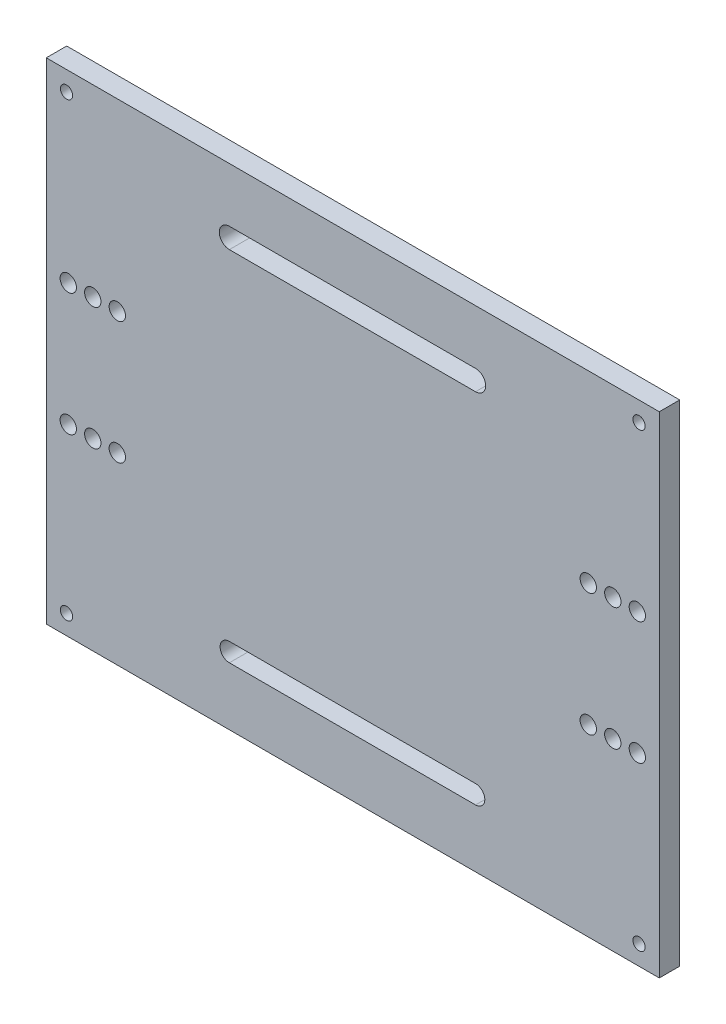
ISO-10303-21;
HEADER;
FILE_DESCRIPTION(('STEP AP214'),'2;1');
FILE_NAME('part.step','',(''),(''),'','','');
FILE_SCHEMA(('AUTOMOTIVE_DESIGN { 1 0 10303 214 1 1 1 1 }'));
ENDSEC;
DATA;
#1=APPLICATION_CONTEXT('core data for automotive mechanical design processes');
#2=APPLICATION_PROTOCOL_DEFINITION('international standard','automotive_design',2000,#1);
#3=PRODUCT_CONTEXT('',#1,'mechanical');
#4=PRODUCT('Part','Part','',(#3));
#5=PRODUCT_RELATED_PRODUCT_CATEGORY('part','',(#4));
#6=PRODUCT_DEFINITION_FORMATION('','',#4);
#7=PRODUCT_DEFINITION_CONTEXT('part definition',#1,'design');
#8=PRODUCT_DEFINITION('design','',#6,#7);
#9=PRODUCT_DEFINITION_SHAPE('','',#8);
#10=(LENGTH_UNIT() NAMED_UNIT(*) SI_UNIT(.MILLI.,.METRE.));
#11=(NAMED_UNIT(*) PLANE_ANGLE_UNIT() SI_UNIT($,.RADIAN.));
#12=(NAMED_UNIT(*) SI_UNIT($,.STERADIAN.) SOLID_ANGLE_UNIT());
#13=UNCERTAINTY_MEASURE_WITH_UNIT(LENGTH_MEASURE(1.E-05),#10,'distance_accuracy_value','');
#14=(GEOMETRIC_REPRESENTATION_CONTEXT(3) GLOBAL_UNCERTAINTY_ASSIGNED_CONTEXT((#13)) GLOBAL_UNIT_ASSIGNED_CONTEXT((#10,
#11,#12)) REPRESENTATION_CONTEXT('',''));
#15=CARTESIAN_POINT('',(0.,0.,0.));
#16=DIRECTION('',(0.,0.,1.));
#17=DIRECTION('',(1.,0.,0.));
#18=AXIS2_PLACEMENT_3D('',#15,#16,#17);
#19=CARTESIAN_POINT('',(0.,138.680861872725,5.));
#20=DIRECTION('',(0.,-1.,0.));
#21=DIRECTION('',(0.,0.,-1.));
#22=AXIS2_PLACEMENT_3D('',#19,#20,#21);
#23=PLANE('',#22);
#24=DIRECTION('',(-1.,0.,0.));
#25=VECTOR('',#24,1.);
#26=CARTESIAN_POINT('',(0.,138.680861872725,0.));
#27=LINE('',#26,#25);
#28=CARTESIAN_POINT('',(165.051044638639,138.680861872725,0.));
#29=VERTEX_POINT('',#28);
#30=CARTESIAN_POINT('',(15.0510446386395,138.680861872725,0.));
#31=VERTEX_POINT('',#30);
#32=EDGE_CURVE('E301',#29,#31,#27,.T.);
#33=ORIENTED_EDGE('',*,*,#32,.T.);
#34=DIRECTION('',(0.,0.,-1.));
#35=VECTOR('',#34,1.);
#36=CARTESIAN_POINT('',(15.0510446386395,138.680861872725,5.));
#37=LINE('',#36,#35);
#38=CARTESIAN_POINT('',(15.0510446386395,138.680861872725,5.));
#39=VERTEX_POINT('',#38);
#40=EDGE_CURVE('E11',#39,#31,#37,.T.);
#41=ORIENTED_EDGE('',*,*,#40,.F.);
#42=DIRECTION('',(-1.,0.,0.));
#43=VECTOR('',#42,1.);
#44=CARTESIAN_POINT('',(0.,138.680861872725,5.));
#45=LINE('',#44,#43);
#46=CARTESIAN_POINT('',(165.051044638639,138.680861872725,5.));
#47=VERTEX_POINT('',#46);
#48=EDGE_CURVE('E244',#47,#39,#45,.T.);
#49=ORIENTED_EDGE('',*,*,#48,.F.);
#50=DIRECTION('',(0.,0.,-1.));
#51=VECTOR('',#50,1.);
#52=CARTESIAN_POINT('',(165.051044638639,138.680861872725,5.));
#53=LINE('',#52,#51);
#54=EDGE_CURVE('E253',#47,#29,#53,.T.);
#55=ORIENTED_EDGE('',*,*,#54,.T.);
#56=EDGE_LOOP('',(#33,#41,#49,#55));
#57=FACE_BOUND('',#56,.T.);
#58=ADVANCED_FACE('F37',(#57),#23,.F.);
#59=CARTESIAN_POINT('',(15.0510446386395,0.,5.));
#60=DIRECTION('',(1.,0.,0.));
#61=DIRECTION('',(0.,0.,-1.));
#62=AXIS2_PLACEMENT_3D('',#59,#60,#61);
#63=PLANE('',#62);
#64=DIRECTION('',(0.,-1.,0.));
#65=VECTOR('',#64,1.);
#66=CARTESIAN_POINT('',(15.0510446386395,0.,0.));
#67=LINE('',#66,#65);
#68=CARTESIAN_POINT('',(15.0510446386395,18.6808618727253,0.));
#69=VERTEX_POINT('',#68);
#70=EDGE_CURVE('E304',#31,#69,#67,.T.);
#71=ORIENTED_EDGE('',*,*,#70,.T.);
#72=DIRECTION('',(0.,0.,-1.));
#73=VECTOR('',#72,1.);
#74=CARTESIAN_POINT('',(15.0510446386395,18.6808618727253,5.));
#75=LINE('',#74,#73);
#76=CARTESIAN_POINT('',(15.0510446386395,18.6808618727253,5.));
#77=VERTEX_POINT('',#76);
#78=EDGE_CURVE('E45',#77,#69,#75,.T.);
#79=ORIENTED_EDGE('',*,*,#78,.F.);
#80=DIRECTION('',(0.,-1.,0.));
#81=VECTOR('',#80,1.);
#82=CARTESIAN_POINT('',(15.0510446386395,0.,5.));
#83=LINE('',#82,#81);
#84=EDGE_CURVE('E247',#39,#77,#83,.T.);
#85=ORIENTED_EDGE('',*,*,#84,.F.);
#86=ORIENTED_EDGE('',*,*,#40,.T.);
#87=EDGE_LOOP('',(#71,#79,#85,#86));
#88=FACE_BOUND('',#87,.T.);
#89=ADVANCED_FACE('F333',(#88),#63,.F.);
#90=CARTESIAN_POINT('',(0.,18.6808618727253,5.));
#91=DIRECTION('',(0.,1.,0.));
#92=DIRECTION('',(-1.,0.,0.));
#93=AXIS2_PLACEMENT_3D('',#90,#91,#92);
#94=PLANE('',#93);
#95=DIRECTION('',(1.,0.,0.));
#96=VECTOR('',#95,1.);
#97=CARTESIAN_POINT('',(0.,18.6808618727253,0.));
#98=LINE('',#97,#96);
#99=CARTESIAN_POINT('',(165.051044638639,18.6808618727253,0.));
#100=VERTEX_POINT('',#99);
#101=EDGE_CURVE('E306',#69,#100,#98,.T.);
#102=ORIENTED_EDGE('',*,*,#101,.T.);
#103=DIRECTION('',(0.,0.,-1.));
#104=VECTOR('',#103,1.);
#105=CARTESIAN_POINT('',(165.051044638639,18.6808618727253,5.));
#106=LINE('',#105,#104);
#107=CARTESIAN_POINT('',(165.051044638639,18.6808618727253,5.));
#108=VERTEX_POINT('',#107);
#109=EDGE_CURVE('E311',#108,#100,#106,.T.);
#110=ORIENTED_EDGE('',*,*,#109,.F.);
#111=DIRECTION('',(1.,0.,0.));
#112=VECTOR('',#111,1.);
#113=CARTESIAN_POINT('',(0.,18.6808618727253,5.));
#114=LINE('',#113,#112);
#115=EDGE_CURVE('E249',#77,#108,#114,.T.);
#116=ORIENTED_EDGE('',*,*,#115,.F.);
#117=ORIENTED_EDGE('',*,*,#78,.T.);
#118=EDGE_LOOP('',(#102,#110,#116,#117));
#119=FACE_BOUND('',#118,.T.);
#120=ADVANCED_FACE('F318',(#119),#94,.F.);
#121=CARTESIAN_POINT('',(20.4274241830881,93.6808618727253,5.));
#122=DIRECTION('',(0.,0.,-1.));
#123=DIRECTION('',(-1.,0.,0.));
#124=AXIS2_PLACEMENT_3D('',#121,#122,#123);
#125=CYLINDRICAL_SURFACE('',#124,2.);
#126=CARTESIAN_POINT('',(20.4274241830881,93.6808618727253,5.));
#127=DIRECTION('',(0.,0.,1.));
#128=DIRECTION('',(1.,0.,0.));
#129=AXIS2_PLACEMENT_3D('',#126,#127,#128);
#130=CIRCLE('',#129,2.);
#131=CARTESIAN_POINT('',(22.4274241830881,93.6808618727253,5.));
#132=VERTEX_POINT('',#131);
#133=EDGE_CURVE('E241',#132,#132,#130,.T.);
#134=ORIENTED_EDGE('',*,*,#133,.T.);
#135=EDGE_LOOP('',(#134));
#136=FACE_BOUND('',#135,.T.);
#137=CARTESIAN_POINT('',(20.4274241830881,93.6808618727253,0.));
#138=DIRECTION('',(0.,0.,1.));
#139=DIRECTION('',(1.,0.,0.));
#140=AXIS2_PLACEMENT_3D('',#137,#138,#139);
#141=CIRCLE('',#140,2.);
#142=CARTESIAN_POINT('',(22.4274241830881,93.6808618727253,0.));
#143=VERTEX_POINT('',#142);
#144=EDGE_CURVE('E298',#143,#143,#141,.T.);
#145=ORIENTED_EDGE('',*,*,#144,.F.);
#146=EDGE_LOOP('',(#145));
#147=FACE_BOUND('',#146,.T.);
#148=ADVANCED_FACE('F340',(#136,#147),#125,.F.);
#149=CARTESIAN_POINT('',(26.4274241830881,93.6808618727253,5.));
#150=DIRECTION('',(0.,0.,-1.));
#151=DIRECTION('',(-1.,0.,0.));
#152=AXIS2_PLACEMENT_3D('',#149,#150,#151);
#153=CYLINDRICAL_SURFACE('',#152,2.);
#154=CARTESIAN_POINT('',(26.4274241830881,93.6808618727253,5.));
#155=DIRECTION('',(0.,0.,1.));
#156=DIRECTION('',(1.,0.,0.));
#157=AXIS2_PLACEMENT_3D('',#154,#155,#156);
#158=CIRCLE('',#157,2.);
#159=CARTESIAN_POINT('',(28.4274241830881,93.6808618727253,5.));
#160=VERTEX_POINT('',#159);
#161=EDGE_CURVE('E238',#160,#160,#158,.T.);
#162=ORIENTED_EDGE('',*,*,#161,.T.);
#163=EDGE_LOOP('',(#162));
#164=FACE_BOUND('',#163,.T.);
#165=CARTESIAN_POINT('',(26.4274241830881,93.6808618727253,0.));
#166=DIRECTION('',(0.,0.,1.));
#167=DIRECTION('',(1.,0.,0.));
#168=AXIS2_PLACEMENT_3D('',#165,#166,#167);
#169=CIRCLE('',#168,2.);
#170=CARTESIAN_POINT('',(28.4274241830881,93.6808618727253,0.));
#171=VERTEX_POINT('',#170);
#172=EDGE_CURVE('E295',#171,#171,#169,.T.);
#173=ORIENTED_EDGE('',*,*,#172,.F.);
#174=EDGE_LOOP('',(#173));
#175=FACE_BOUND('',#174,.T.);
#176=ADVANCED_FACE('F347',(#164,#175),#153,.F.);
#177=CARTESIAN_POINT('',(32.4274241830881,93.6808618727253,5.));
#178=DIRECTION('',(0.,0.,-1.));
#179=DIRECTION('',(-1.,0.,0.));
#180=AXIS2_PLACEMENT_3D('',#177,#178,#179);
#181=CYLINDRICAL_SURFACE('',#180,2.);
#182=CARTESIAN_POINT('',(32.4274241830881,93.6808618727253,5.));
#183=DIRECTION('',(0.,0.,1.));
#184=DIRECTION('',(1.,0.,0.));
#185=AXIS2_PLACEMENT_3D('',#182,#183,#184);
#186=CIRCLE('',#185,2.);
#187=CARTESIAN_POINT('',(34.4274241830881,93.6808618727253,5.));
#188=VERTEX_POINT('',#187);
#189=EDGE_CURVE('E235',#188,#188,#186,.T.);
#190=ORIENTED_EDGE('',*,*,#189,.T.);
#191=EDGE_LOOP('',(#190));
#192=FACE_BOUND('',#191,.T.);
#193=CARTESIAN_POINT('',(32.4274241830881,93.6808618727253,0.));
#194=DIRECTION('',(0.,0.,1.));
#195=DIRECTION('',(1.,0.,0.));
#196=AXIS2_PLACEMENT_3D('',#193,#194,#195);
#197=CIRCLE('',#196,2.);
#198=CARTESIAN_POINT('',(34.4274241830881,93.6808618727253,0.));
#199=VERTEX_POINT('',#198);
#200=EDGE_CURVE('E292',#199,#199,#197,.T.);
#201=ORIENTED_EDGE('',*,*,#200,.F.);
#202=EDGE_LOOP('',(#201));
#203=FACE_BOUND('',#202,.T.);
#204=ADVANCED_FACE('F351',(#192,#203),#181,.F.);
#205=CARTESIAN_POINT('',(20.4274241830881,63.6808618727253,5.));
#206=DIRECTION('',(0.,0.,-1.));
#207=DIRECTION('',(-1.,0.,0.));
#208=AXIS2_PLACEMENT_3D('',#205,#206,#207);
#209=CYLINDRICAL_SURFACE('',#208,2.);
#210=CARTESIAN_POINT('',(20.4274241830881,63.6808618727253,5.));
#211=DIRECTION('',(0.,0.,1.));
#212=DIRECTION('',(1.,0.,0.));
#213=AXIS2_PLACEMENT_3D('',#210,#211,#212);
#214=CIRCLE('',#213,2.);
#215=CARTESIAN_POINT('',(22.4274241830881,63.6808618727253,5.));
#216=VERTEX_POINT('',#215);
#217=EDGE_CURVE('E232',#216,#216,#214,.T.);
#218=ORIENTED_EDGE('',*,*,#217,.T.);
#219=EDGE_LOOP('',(#218));
#220=FACE_BOUND('',#219,.T.);
#221=CARTESIAN_POINT('',(20.4274241830881,63.6808618727253,0.));
#222=DIRECTION('',(0.,0.,1.));
#223=DIRECTION('',(1.,0.,0.));
#224=AXIS2_PLACEMENT_3D('',#221,#222,#223);
#225=CIRCLE('',#224,2.);
#226=CARTESIAN_POINT('',(22.4274241830881,63.6808618727253,0.));
#227=VERTEX_POINT('',#226);
#228=EDGE_CURVE('E289',#227,#227,#225,.T.);
#229=ORIENTED_EDGE('',*,*,#228,.F.);
#230=EDGE_LOOP('',(#229));
#231=FACE_BOUND('',#230,.T.);
#232=ADVANCED_FACE('F355',(#220,#231),#209,.F.);
#233=CARTESIAN_POINT('',(26.4274241830881,63.6808618727253,5.));
#234=DIRECTION('',(0.,0.,-1.));
#235=DIRECTION('',(-1.,0.,0.));
#236=AXIS2_PLACEMENT_3D('',#233,#234,#235);
#237=CYLINDRICAL_SURFACE('',#236,2.);
#238=CARTESIAN_POINT('',(26.4274241830881,63.6808618727253,5.));
#239=DIRECTION('',(0.,0.,1.));
#240=DIRECTION('',(1.,0.,0.));
#241=AXIS2_PLACEMENT_3D('',#238,#239,#240);
#242=CIRCLE('',#241,2.);
#243=CARTESIAN_POINT('',(28.4274241830881,63.6808618727253,5.));
#244=VERTEX_POINT('',#243);
#245=EDGE_CURVE('E229',#244,#244,#242,.T.);
#246=ORIENTED_EDGE('',*,*,#245,.T.);
#247=EDGE_LOOP('',(#246));
#248=FACE_BOUND('',#247,.T.);
#249=CARTESIAN_POINT('',(26.4274241830881,63.6808618727253,0.));
#250=DIRECTION('',(0.,0.,1.));
#251=DIRECTION('',(1.,0.,0.));
#252=AXIS2_PLACEMENT_3D('',#249,#250,#251);
#253=CIRCLE('',#252,2.);
#254=CARTESIAN_POINT('',(28.4274241830881,63.6808618727253,0.));
#255=VERTEX_POINT('',#254);
#256=EDGE_CURVE('E286',#255,#255,#253,.T.);
#257=ORIENTED_EDGE('',*,*,#256,.F.);
#258=EDGE_LOOP('',(#257));
#259=FACE_BOUND('',#258,.T.);
#260=ADVANCED_FACE('F359',(#248,#259),#237,.F.);
#261=CARTESIAN_POINT('',(32.4274241830881,63.6808618727253,5.));
#262=DIRECTION('',(0.,0.,-1.));
#263=DIRECTION('',(-1.,0.,0.));
#264=AXIS2_PLACEMENT_3D('',#261,#262,#263);
#265=CYLINDRICAL_SURFACE('',#264,2.);
#266=CARTESIAN_POINT('',(32.4274241830881,63.6808618727253,5.));
#267=DIRECTION('',(0.,0.,1.));
#268=DIRECTION('',(1.,0.,0.));
#269=AXIS2_PLACEMENT_3D('',#266,#267,#268);
#270=CIRCLE('',#269,2.);
#271=CARTESIAN_POINT('',(34.4274241830881,63.6808618727253,5.));
#272=VERTEX_POINT('',#271);
#273=EDGE_CURVE('E226',#272,#272,#270,.T.);
#274=ORIENTED_EDGE('',*,*,#273,.T.);
#275=EDGE_LOOP('',(#274));
#276=FACE_BOUND('',#275,.T.);
#277=CARTESIAN_POINT('',(32.4274241830881,63.6808618727253,0.));
#278=DIRECTION('',(0.,0.,1.));
#279=DIRECTION('',(1.,0.,0.));
#280=AXIS2_PLACEMENT_3D('',#277,#278,#279);
#281=CIRCLE('',#280,2.);
#282=CARTESIAN_POINT('',(34.4274241830881,63.6808618727253,0.));
#283=VERTEX_POINT('',#282);
#284=EDGE_CURVE('E283',#283,#283,#281,.T.);
#285=ORIENTED_EDGE('',*,*,#284,.F.);
#286=EDGE_LOOP('',(#285));
#287=FACE_BOUND('',#286,.T.);
#288=ADVANCED_FACE('F363',(#276,#287),#265,.F.);
#289=CARTESIAN_POINT('',(159.674665094191,93.6808618727253,5.));
#290=DIRECTION('',(0.,0.,-1.));
#291=DIRECTION('',(-1.,0.,0.));
#292=AXIS2_PLACEMENT_3D('',#289,#290,#291);
#293=CYLINDRICAL_SURFACE('',#292,2.);
#294=CARTESIAN_POINT('',(159.674665094191,93.6808618727253,5.));
#295=DIRECTION('',(0.,0.,1.));
#296=DIRECTION('',(1.,0.,0.));
#297=AXIS2_PLACEMENT_3D('',#294,#295,#296);
#298=CIRCLE('',#297,2.);
#299=CARTESIAN_POINT('',(161.674665094191,93.6808618727253,5.));
#300=VERTEX_POINT('',#299);
#301=EDGE_CURVE('E223',#300,#300,#298,.T.);
#302=ORIENTED_EDGE('',*,*,#301,.T.);
#303=EDGE_LOOP('',(#302));
#304=FACE_BOUND('',#303,.T.);
#305=CARTESIAN_POINT('',(159.674665094191,93.6808618727253,0.));
#306=DIRECTION('',(0.,0.,1.));
#307=DIRECTION('',(1.,0.,0.));
#308=AXIS2_PLACEMENT_3D('',#305,#306,#307);
#309=CIRCLE('',#308,2.);
#310=CARTESIAN_POINT('',(161.674665094191,93.6808618727253,0.));
#311=VERTEX_POINT('',#310);
#312=EDGE_CURVE('E280',#311,#311,#309,.T.);
#313=ORIENTED_EDGE('',*,*,#312,.F.);
#314=EDGE_LOOP('',(#313));
#315=FACE_BOUND('',#314,.T.);
#316=ADVANCED_FACE('F367',(#304,#315),#293,.F.);
#317=CARTESIAN_POINT('',(153.674665094191,93.6808618727253,5.));
#318=DIRECTION('',(0.,0.,-1.));
#319=DIRECTION('',(-1.,0.,0.));
#320=AXIS2_PLACEMENT_3D('',#317,#318,#319);
#321=CYLINDRICAL_SURFACE('',#320,2.);
#322=CARTESIAN_POINT('',(153.674665094191,93.6808618727253,5.));
#323=DIRECTION('',(0.,0.,1.));
#324=DIRECTION('',(1.,0.,0.));
#325=AXIS2_PLACEMENT_3D('',#322,#323,#324);
#326=CIRCLE('',#325,2.);
#327=CARTESIAN_POINT('',(155.674665094191,93.6808618727253,5.));
#328=VERTEX_POINT('',#327);
#329=EDGE_CURVE('E220',#328,#328,#326,.T.);
#330=ORIENTED_EDGE('',*,*,#329,.T.);
#331=EDGE_LOOP('',(#330));
#332=FACE_BOUND('',#331,.T.);
#333=CARTESIAN_POINT('',(153.674665094191,93.6808618727253,0.));
#334=DIRECTION('',(0.,0.,1.));
#335=DIRECTION('',(1.,0.,0.));
#336=AXIS2_PLACEMENT_3D('',#333,#334,#335);
#337=CIRCLE('',#336,2.);
#338=CARTESIAN_POINT('',(155.674665094191,93.6808618727253,0.));
#339=VERTEX_POINT('',#338);
#340=EDGE_CURVE('E277',#339,#339,#337,.T.);
#341=ORIENTED_EDGE('',*,*,#340,.F.);
#342=EDGE_LOOP('',(#341));
#343=FACE_BOUND('',#342,.T.);
#344=ADVANCED_FACE('F371',(#332,#343),#321,.F.);
#345=CARTESIAN_POINT('',(147.674665094191,93.6808618727253,5.));
#346=DIRECTION('',(0.,0.,-1.));
#347=DIRECTION('',(-1.,0.,0.));
#348=AXIS2_PLACEMENT_3D('',#345,#346,#347);
#349=CYLINDRICAL_SURFACE('',#348,2.);
#350=CARTESIAN_POINT('',(147.674665094191,93.6808618727253,5.));
#351=DIRECTION('',(0.,0.,1.));
#352=DIRECTION('',(1.,0.,0.));
#353=AXIS2_PLACEMENT_3D('',#350,#351,#352);
#354=CIRCLE('',#353,2.);
#355=CARTESIAN_POINT('',(149.674665094191,93.6808618727253,5.));
#356=VERTEX_POINT('',#355);
#357=EDGE_CURVE('E217',#356,#356,#354,.T.);
#358=ORIENTED_EDGE('',*,*,#357,.T.);
#359=EDGE_LOOP('',(#358));
#360=FACE_BOUND('',#359,.T.);
#361=CARTESIAN_POINT('',(147.674665094191,93.6808618727253,0.));
#362=DIRECTION('',(0.,0.,1.));
#363=DIRECTION('',(1.,0.,0.));
#364=AXIS2_PLACEMENT_3D('',#361,#362,#363);
#365=CIRCLE('',#364,2.);
#366=CARTESIAN_POINT('',(149.674665094191,93.6808618727253,0.));
#367=VERTEX_POINT('',#366);
#368=EDGE_CURVE('E274',#367,#367,#365,.T.);
#369=ORIENTED_EDGE('',*,*,#368,.F.);
#370=EDGE_LOOP('',(#369));
#371=FACE_BOUND('',#370,.T.);
#372=ADVANCED_FACE('F375',(#360,#371),#349,.F.);
#373=CARTESIAN_POINT('',(159.674665094191,63.6808618727253,5.));
#374=DIRECTION('',(0.,0.,-1.));
#375=DIRECTION('',(-1.,0.,0.));
#376=AXIS2_PLACEMENT_3D('',#373,#374,#375);
#377=CYLINDRICAL_SURFACE('',#376,2.);
#378=CARTESIAN_POINT('',(159.674665094191,63.6808618727253,5.));
#379=DIRECTION('',(0.,0.,1.));
#380=DIRECTION('',(1.,0.,0.));
#381=AXIS2_PLACEMENT_3D('',#378,#379,#380);
#382=CIRCLE('',#381,2.);
#383=CARTESIAN_POINT('',(161.674665094191,63.6808618727253,5.));
#384=VERTEX_POINT('',#383);
#385=EDGE_CURVE('E214',#384,#384,#382,.T.);
#386=ORIENTED_EDGE('',*,*,#385,.T.);
#387=EDGE_LOOP('',(#386));
#388=FACE_BOUND('',#387,.T.);
#389=CARTESIAN_POINT('',(159.674665094191,63.6808618727253,0.));
#390=DIRECTION('',(0.,0.,1.));
#391=DIRECTION('',(1.,0.,0.));
#392=AXIS2_PLACEMENT_3D('',#389,#390,#391);
#393=CIRCLE('',#392,2.);
#394=CARTESIAN_POINT('',(161.674665094191,63.6808618727253,0.));
#395=VERTEX_POINT('',#394);
#396=EDGE_CURVE('E271',#395,#395,#393,.T.);
#397=ORIENTED_EDGE('',*,*,#396,.F.);
#398=EDGE_LOOP('',(#397));
#399=FACE_BOUND('',#398,.T.);
#400=ADVANCED_FACE('F379',(#388,#399),#377,.F.);
#401=CARTESIAN_POINT('',(153.674665094191,63.6808618727253,5.));
#402=DIRECTION('',(0.,0.,-1.));
#403=DIRECTION('',(-1.,0.,0.));
#404=AXIS2_PLACEMENT_3D('',#401,#402,#403);
#405=CYLINDRICAL_SURFACE('',#404,2.);
#406=CARTESIAN_POINT('',(153.674665094191,63.6808618727253,5.));
#407=DIRECTION('',(0.,0.,1.));
#408=DIRECTION('',(1.,0.,0.));
#409=AXIS2_PLACEMENT_3D('',#406,#407,#408);
#410=CIRCLE('',#409,2.);
#411=CARTESIAN_POINT('',(155.674665094191,63.6808618727253,5.));
#412=VERTEX_POINT('',#411);
#413=EDGE_CURVE('E211',#412,#412,#410,.T.);
#414=ORIENTED_EDGE('',*,*,#413,.T.);
#415=EDGE_LOOP('',(#414));
#416=FACE_BOUND('',#415,.T.);
#417=CARTESIAN_POINT('',(153.674665094191,63.6808618727253,0.));
#418=DIRECTION('',(0.,0.,1.));
#419=DIRECTION('',(1.,0.,0.));
#420=AXIS2_PLACEMENT_3D('',#417,#418,#419);
#421=CIRCLE('',#420,2.);
#422=CARTESIAN_POINT('',(155.674665094191,63.6808618727253,0.));
#423=VERTEX_POINT('',#422);
#424=EDGE_CURVE('E268',#423,#423,#421,.T.);
#425=ORIENTED_EDGE('',*,*,#424,.F.);
#426=EDGE_LOOP('',(#425));
#427=FACE_BOUND('',#426,.T.);
#428=ADVANCED_FACE('F383',(#416,#427),#405,.F.);
#429=CARTESIAN_POINT('',(147.674665094191,63.6808618727253,5.));
#430=DIRECTION('',(0.,0.,-1.));
#431=DIRECTION('',(-1.,0.,0.));
#432=AXIS2_PLACEMENT_3D('',#429,#430,#431);
#433=CYLINDRICAL_SURFACE('',#432,2.);
#434=CARTESIAN_POINT('',(147.674665094191,63.6808618727253,5.));
#435=DIRECTION('',(0.,0.,1.));
#436=DIRECTION('',(1.,0.,0.));
#437=AXIS2_PLACEMENT_3D('',#434,#435,#436);
#438=CIRCLE('',#437,2.);
#439=CARTESIAN_POINT('',(149.674665094191,63.6808618727253,5.));
#440=VERTEX_POINT('',#439);
#441=EDGE_CURVE('E208',#440,#440,#438,.T.);
#442=ORIENTED_EDGE('',*,*,#441,.T.);
#443=EDGE_LOOP('',(#442));
#444=FACE_BOUND('',#443,.T.);
#445=CARTESIAN_POINT('',(147.674665094191,63.6808618727253,0.));
#446=DIRECTION('',(0.,0.,1.));
#447=DIRECTION('',(1.,0.,0.));
#448=AXIS2_PLACEMENT_3D('',#445,#446,#447);
#449=CIRCLE('',#448,2.);
#450=CARTESIAN_POINT('',(149.674665094191,63.6808618727253,0.));
#451=VERTEX_POINT('',#450);
#452=EDGE_CURVE('E265',#451,#451,#449,.T.);
#453=ORIENTED_EDGE('',*,*,#452,.F.);
#454=EDGE_LOOP('',(#453));
#455=FACE_BOUND('',#454,.T.);
#456=ADVANCED_FACE('F387',(#444,#455),#433,.F.);
#457=CARTESIAN_POINT('',(20.0056706292298,133.907298568765,5.));
#458=DIRECTION('',(0.,0.,-1.));
#459=DIRECTION('',(-1.,0.,0.));
#460=AXIS2_PLACEMENT_3D('',#457,#458,#459);
#461=CYLINDRICAL_SURFACE('',#460,1.5);
#462=CARTESIAN_POINT('',(20.0056706292298,133.907298568765,5.));
#463=DIRECTION('',(0.,0.,1.));
#464=DIRECTION('',(1.,0.,0.));
#465=AXIS2_PLACEMENT_3D('',#462,#463,#464);
#466=CIRCLE('',#465,1.5);
#467=CARTESIAN_POINT('',(21.5056706292298,133.907298568765,5.));
#468=VERTEX_POINT('',#467);
#469=EDGE_CURVE('E205',#468,#468,#466,.T.);
#470=ORIENTED_EDGE('',*,*,#469,.T.);
#471=EDGE_LOOP('',(#470));
#472=FACE_BOUND('',#471,.T.);
#473=CARTESIAN_POINT('',(20.0056706292298,133.907298568765,0.));
#474=DIRECTION('',(0.,0.,1.));
#475=DIRECTION('',(1.,0.,0.));
#476=AXIS2_PLACEMENT_3D('',#473,#474,#475);
#477=CIRCLE('',#476,1.5);
#478=CARTESIAN_POINT('',(21.5056706292298,133.907298568765,0.));
#479=VERTEX_POINT('',#478);
#480=EDGE_CURVE('E262',#479,#479,#477,.T.);
#481=ORIENTED_EDGE('',*,*,#480,.F.);
#482=EDGE_LOOP('',(#481));
#483=FACE_BOUND('',#482,.T.);
#484=ADVANCED_FACE('F391',(#472,#483),#461,.F.);
#485=CARTESIAN_POINT('',(160.096418648049,133.907298568765,5.));
#486=DIRECTION('',(0.,0.,-1.));
#487=DIRECTION('',(-1.,0.,0.));
#488=AXIS2_PLACEMENT_3D('',#485,#486,#487);
#489=CYLINDRICAL_SURFACE('',#488,1.5);
#490=CARTESIAN_POINT('',(160.096418648049,133.907298568765,5.));
#491=DIRECTION('',(0.,0.,1.));
#492=DIRECTION('',(1.,0.,0.));
#493=AXIS2_PLACEMENT_3D('',#490,#491,#492);
#494=CIRCLE('',#493,1.5);
#495=CARTESIAN_POINT('',(161.596418648049,133.907298568765,5.));
#496=VERTEX_POINT('',#495);
#497=EDGE_CURVE('E202',#496,#496,#494,.T.);
#498=ORIENTED_EDGE('',*,*,#497,.T.);
#499=EDGE_LOOP('',(#498));
#500=FACE_BOUND('',#499,.T.);
#501=CARTESIAN_POINT('',(160.096418648049,133.907298568765,0.));
#502=DIRECTION('',(0.,0.,1.));
#503=DIRECTION('',(1.,0.,0.));
#504=AXIS2_PLACEMENT_3D('',#501,#502,#503);
#505=CIRCLE('',#504,1.5);
#506=CARTESIAN_POINT('',(161.596418648049,133.907298568765,0.));
#507=VERTEX_POINT('',#506);
#508=EDGE_CURVE('E259',#507,#507,#505,.T.);
#509=ORIENTED_EDGE('',*,*,#508,.F.);
#510=EDGE_LOOP('',(#509));
#511=FACE_BOUND('',#510,.T.);
#512=ADVANCED_FACE('F395',(#500,#511),#489,.F.);
#513=CARTESIAN_POINT('',(20.0056706292298,23.4544251766853,5.));
#514=DIRECTION('',(0.,0.,-1.));
#515=DIRECTION('',(-1.,0.,0.));
#516=AXIS2_PLACEMENT_3D('',#513,#514,#515);
#517=CYLINDRICAL_SURFACE('',#516,1.5);
#518=CARTESIAN_POINT('',(20.0056706292298,23.4544251766853,5.));
#519=DIRECTION('',(0.,0.,1.));
#520=DIRECTION('',(1.,0.,0.));
#521=AXIS2_PLACEMENT_3D('',#518,#519,#520);
#522=CIRCLE('',#521,1.5);
#523=CARTESIAN_POINT('',(21.5056706292298,23.4544251766853,5.));
#524=VERTEX_POINT('',#523);
#525=EDGE_CURVE('E198',#524,#524,#522,.T.);
#526=ORIENTED_EDGE('',*,*,#525,.T.);
#527=EDGE_LOOP('',(#526));
#528=FACE_BOUND('',#527,.T.);
#529=CARTESIAN_POINT('',(20.0056706292298,23.4544251766853,0.));
#530=DIRECTION('',(0.,0.,1.));
#531=DIRECTION('',(1.,0.,0.));
#532=AXIS2_PLACEMENT_3D('',#529,#530,#531);
#533=CIRCLE('',#532,1.5);
#534=CARTESIAN_POINT('',(21.5056706292298,23.4544251766853,0.));
#535=VERTEX_POINT('',#534);
#536=EDGE_CURVE('E256',#535,#535,#533,.T.);
#537=ORIENTED_EDGE('',*,*,#536,.F.);
#538=EDGE_LOOP('',(#537));
#539=FACE_BOUND('',#538,.T.);
#540=ADVANCED_FACE('F398',(#528,#539),#517,.F.);
#541=CARTESIAN_POINT('',(160.096418648049,23.4544251766853,5.));
#542=DIRECTION('',(0.,0.,-1.));
#543=DIRECTION('',(-1.,0.,0.));
#544=AXIS2_PLACEMENT_3D('',#541,#542,#543);
#545=CYLINDRICAL_SURFACE('',#544,1.5);
#546=CARTESIAN_POINT('',(160.096418648049,23.4544251766853,5.));
#547=DIRECTION('',(0.,0.,1.));
#548=DIRECTION('',(1.,0.,0.));
#549=AXIS2_PLACEMENT_3D('',#546,#547,#548);
#550=CIRCLE('',#549,1.5);
#551=CARTESIAN_POINT('',(161.596418648049,23.4544251766853,5.));
#552=VERTEX_POINT('',#551);
#553=EDGE_CURVE('E195',#552,#552,#550,.T.);
#554=ORIENTED_EDGE('',*,*,#553,.T.);
#555=EDGE_LOOP('',(#554));
#556=FACE_BOUND('',#555,.T.);
#557=CARTESIAN_POINT('',(160.096418648049,23.4544251766853,0.));
#558=DIRECTION('',(0.,0.,1.));
#559=DIRECTION('',(1.,0.,0.));
#560=AXIS2_PLACEMENT_3D('',#557,#558,#559);
#561=CIRCLE('',#560,1.5);
#562=CARTESIAN_POINT('',(161.596418648049,23.4544251766853,0.));
#563=VERTEX_POINT('',#562);
#564=EDGE_CURVE('E188',#563,#563,#561,.T.);
#565=ORIENTED_EDGE('',*,*,#564,.F.);
#566=EDGE_LOOP('',(#565));
#567=FACE_BOUND('',#566,.T.);
#568=ADVANCED_FACE('F39',(#556,#567),#545,.F.);
#569=CARTESIAN_POINT('',(165.051044638639,0.,5.));
#570=DIRECTION('',(-1.,0.,0.));
#571=DIRECTION('',(0.,0.,1.));
#572=AXIS2_PLACEMENT_3D('',#569,#570,#571);
#573=PLANE('',#572);
#574=DIRECTION('',(0.,1.,0.));
#575=VECTOR('',#574,1.);
#576=CARTESIAN_POINT('',(165.051044638639,0.,0.));
#577=LINE('',#576,#575);
#578=EDGE_CURVE('E199',#100,#29,#577,.T.);
#579=ORIENTED_EDGE('',*,*,#578,.T.);
#580=ORIENTED_EDGE('',*,*,#54,.F.);
#581=DIRECTION('',(0.,1.,0.));
#582=VECTOR('',#581,1.);
#583=CARTESIAN_POINT('',(165.051044638639,0.,5.));
#584=LINE('',#583,#582);
#585=EDGE_CURVE('E251',#108,#47,#584,.T.);
#586=ORIENTED_EDGE('',*,*,#585,.F.);
#587=ORIENTED_EDGE('',*,*,#109,.T.);
#588=EDGE_LOOP('',(#579,#580,#586,#587));
#589=FACE_BOUND('',#588,.T.);
#590=ADVANCED_FACE('F326',(#589),#573,.F.);
#591=CARTESIAN_POINT('',(0.,0.,5.));
#592=DIRECTION('',(0.,0.,1.));
#593=DIRECTION('',(1.,0.,0.));
#594=AXIS2_PLACEMENT_3D('',#591,#592,#593);
#595=PLANE('',#594);
#596=CARTESIAN_POINT('',(59.8485104672338,35.1439446800012,5.));
#597=DIRECTION('',(0.,0.,1.));
#598=DIRECTION('',(1.,0.,0.));
#599=AXIS2_PLACEMENT_3D('',#596,#597,#598);
#600=CIRCLE('',#599,2.26763795531662);
#601=CARTESIAN_POINT('',(59.8485104672338,37.4115826353178,5.));
#602=VERTEX_POINT('',#601);
#603=CARTESIAN_POINT('',(59.8485104672338,32.8763067246846,5.));
#604=VERTEX_POINT('',#603);
#605=EDGE_CURVE('E52',#602,#604,#600,.T.);
#606=ORIENTED_EDGE('',*,*,#605,.F.);
#607=DIRECTION('',(-1.,0.,0.));
#608=VECTOR('',#607,1.);
#609=CARTESIAN_POINT('',(59.8485104672338,37.4115826353178,5.));
#610=LINE('',#609,#608);
#611=CARTESIAN_POINT('',(120.087630820093,37.4115826353178,5.));
#612=VERTEX_POINT('',#611);
#613=EDGE_CURVE('E144',#612,#602,#610,.T.);
#614=ORIENTED_EDGE('',*,*,#613,.F.);
#615=CARTESIAN_POINT('',(120.087630820093,35.1439446800012,5.));
#616=DIRECTION('',(0.,0.,1.));
#617=DIRECTION('',(1.,0.,0.));
#618=AXIS2_PLACEMENT_3D('',#615,#616,#617);
#619=CIRCLE('',#618,2.26763795531662);
#620=CARTESIAN_POINT('',(120.087630820093,32.8763067246846,5.));
#621=VERTEX_POINT('',#620);
#622=EDGE_CURVE('E147',#621,#612,#619,.T.);
#623=ORIENTED_EDGE('',*,*,#622,.F.);
#624=DIRECTION('',(1.,0.,0.));
#625=VECTOR('',#624,1.);
#626=CARTESIAN_POINT('',(59.8485104672338,32.8763067246846,5.));
#627=LINE('',#626,#625);
#628=EDGE_CURVE('E153',#604,#621,#627,.T.);
#629=ORIENTED_EDGE('',*,*,#628,.F.);
#630=EDGE_LOOP('',(#606,#614,#623,#629));
#631=FACE_BOUND('',#630,.T.);
#632=CARTESIAN_POINT('',(59.8485104672338,122.906001195141,5.));
#633=DIRECTION('',(0.,0.,1.));
#634=DIRECTION('',(1.,0.,0.));
#635=AXIS2_PLACEMENT_3D('',#632,#633,#634);
#636=CIRCLE('',#635,2.47315067483102);
#637=CARTESIAN_POINT('',(59.8485104672338,125.379151869972,5.));
#638=VERTEX_POINT('',#637);
#639=CARTESIAN_POINT('',(59.8485104672338,120.43285052031,5.));
#640=VERTEX_POINT('',#639);
#641=EDGE_CURVE('E159',#638,#640,#636,.T.);
#642=ORIENTED_EDGE('',*,*,#641,.F.);
#643=DIRECTION('',(-1.,0.,0.));
#644=VECTOR('',#643,1.);
#645=CARTESIAN_POINT('',(59.8485104672338,125.379151869972,5.));
#646=LINE('',#645,#644);
#647=CARTESIAN_POINT('',(120.087630820093,125.379151869972,5.));
#648=VERTEX_POINT('',#647);
#649=EDGE_CURVE('E167',#648,#638,#646,.T.);
#650=ORIENTED_EDGE('',*,*,#649,.F.);
#651=CARTESIAN_POINT('',(120.087630820093,122.906001195141,5.));
#652=DIRECTION('',(0.,0.,1.));
#653=DIRECTION('',(1.,0.,0.));
#654=AXIS2_PLACEMENT_3D('',#651,#652,#653);
#655=CIRCLE('',#654,2.47315067483102);
#656=CARTESIAN_POINT('',(120.087630820093,120.43285052031,5.));
#657=VERTEX_POINT('',#656);
#658=EDGE_CURVE('E181',#657,#648,#655,.T.);
#659=ORIENTED_EDGE('',*,*,#658,.F.);
#660=DIRECTION('',(1.,0.,0.));
#661=VECTOR('',#660,1.);
#662=CARTESIAN_POINT('',(59.8485104672338,120.43285052031,5.));
#663=LINE('',#662,#661);
#664=EDGE_CURVE('E178',#640,#657,#663,.T.);
#665=ORIENTED_EDGE('',*,*,#664,.F.);
#666=EDGE_LOOP('',(#642,#650,#659,#665));
#667=FACE_BOUND('',#666,.T.);
#668=ORIENTED_EDGE('',*,*,#553,.F.);
#669=EDGE_LOOP('',(#668));
#670=FACE_BOUND('',#669,.T.);
#671=ORIENTED_EDGE('',*,*,#525,.F.);
#672=EDGE_LOOP('',(#671));
#673=FACE_BOUND('',#672,.T.);
#674=ORIENTED_EDGE('',*,*,#497,.F.);
#675=EDGE_LOOP('',(#674));
#676=FACE_BOUND('',#675,.T.);
#677=ORIENTED_EDGE('',*,*,#469,.F.);
#678=EDGE_LOOP('',(#677));
#679=FACE_BOUND('',#678,.T.);
#680=ORIENTED_EDGE('',*,*,#441,.F.);
#681=EDGE_LOOP('',(#680));
#682=FACE_BOUND('',#681,.T.);
#683=ORIENTED_EDGE('',*,*,#413,.F.);
#684=EDGE_LOOP('',(#683));
#685=FACE_BOUND('',#684,.T.);
#686=ORIENTED_EDGE('',*,*,#385,.F.);
#687=EDGE_LOOP('',(#686));
#688=FACE_BOUND('',#687,.T.);
#689=ORIENTED_EDGE('',*,*,#357,.F.);
#690=EDGE_LOOP('',(#689));
#691=FACE_BOUND('',#690,.T.);
#692=ORIENTED_EDGE('',*,*,#329,.F.);
#693=EDGE_LOOP('',(#692));
#694=FACE_BOUND('',#693,.T.);
#695=ORIENTED_EDGE('',*,*,#301,.F.);
#696=EDGE_LOOP('',(#695));
#697=FACE_BOUND('',#696,.T.);
#698=ORIENTED_EDGE('',*,*,#273,.F.);
#699=EDGE_LOOP('',(#698));
#700=FACE_BOUND('',#699,.T.);
#701=ORIENTED_EDGE('',*,*,#245,.F.);
#702=EDGE_LOOP('',(#701));
#703=FACE_BOUND('',#702,.T.);
#704=ORIENTED_EDGE('',*,*,#217,.F.);
#705=EDGE_LOOP('',(#704));
#706=FACE_BOUND('',#705,.T.);
#707=ORIENTED_EDGE('',*,*,#189,.F.);
#708=EDGE_LOOP('',(#707));
#709=FACE_BOUND('',#708,.T.);
#710=ORIENTED_EDGE('',*,*,#161,.F.);
#711=EDGE_LOOP('',(#710));
#712=FACE_BOUND('',#711,.T.);
#713=ORIENTED_EDGE('',*,*,#133,.F.);
#714=EDGE_LOOP('',(#713));
#715=FACE_BOUND('',#714,.T.);
#716=ORIENTED_EDGE('',*,*,#48,.T.);
#717=ORIENTED_EDGE('',*,*,#84,.T.);
#718=ORIENTED_EDGE('',*,*,#115,.T.);
#719=ORIENTED_EDGE('',*,*,#585,.T.);
#720=EDGE_LOOP('',(#716,#717,#718,#719));
#721=FACE_BOUND('',#720,.T.);
#722=ADVANCED_FACE('F332',(#631,#667,#670,#673,#676,#679,#682,#685,#688,#691,#694,#697,#700,
#703,#706,#709,#712,#715,#721),#595,.T.);
#723=CARTESIAN_POINT('',(0.,0.,0.));
#724=DIRECTION('',(0.,0.,1.));
#725=DIRECTION('',(1.,0.,0.));
#726=AXIS2_PLACEMENT_3D('',#723,#724,#725);
#727=PLANE('',#726);
#728=DIRECTION('',(-1.,0.,0.));
#729=VECTOR('',#728,1.);
#730=CARTESIAN_POINT('',(59.8485104672338,37.4115826353178,0.));
#731=LINE('',#730,#729);
#732=CARTESIAN_POINT('',(120.087630820093,37.4115826353178,0.));
#733=VERTEX_POINT('',#732);
#734=CARTESIAN_POINT('',(59.8485104672338,37.4115826353178,0.));
#735=VERTEX_POINT('',#734);
#736=EDGE_CURVE('E134',#733,#735,#731,.T.);
#737=ORIENTED_EDGE('',*,*,#736,.T.);
#738=CARTESIAN_POINT('',(59.8485104672338,35.1439446800012,0.));
#739=DIRECTION('',(0.,0.,1.));
#740=DIRECTION('',(1.,0.,0.));
#741=AXIS2_PLACEMENT_3D('',#738,#739,#740);
#742=CIRCLE('',#741,2.26763795531662);
#743=CARTESIAN_POINT('',(59.8485104672338,32.8763067246846,0.));
#744=VERTEX_POINT('',#743);
#745=EDGE_CURVE('E128',#735,#744,#742,.T.);
#746=ORIENTED_EDGE('',*,*,#745,.T.);
#747=DIRECTION('',(1.,0.,0.));
#748=VECTOR('',#747,1.);
#749=CARTESIAN_POINT('',(59.8485104672338,32.8763067246846,0.));
#750=LINE('',#749,#748);
#751=CARTESIAN_POINT('',(120.087630820093,32.8763067246846,0.));
#752=VERTEX_POINT('',#751);
#753=EDGE_CURVE('E137',#744,#752,#750,.T.);
#754=ORIENTED_EDGE('',*,*,#753,.T.);
#755=CARTESIAN_POINT('',(120.087630820093,35.1439446800012,0.));
#756=DIRECTION('',(0.,0.,1.));
#757=DIRECTION('',(1.,0.,0.));
#758=AXIS2_PLACEMENT_3D('',#755,#756,#757);
#759=CIRCLE('',#758,2.26763795531662);
#760=EDGE_CURVE('E60',#752,#733,#759,.T.);
#761=ORIENTED_EDGE('',*,*,#760,.T.);
#762=EDGE_LOOP('',(#737,#746,#754,#761));
#763=FACE_BOUND('',#762,.T.);
#764=DIRECTION('',(-1.,0.,0.));
#765=VECTOR('',#764,1.);
#766=CARTESIAN_POINT('',(59.8485104672338,125.379151869972,0.));
#767=LINE('',#766,#765);
#768=CARTESIAN_POINT('',(120.087630820093,125.379151869972,0.));
#769=VERTEX_POINT('',#768);
#770=CARTESIAN_POINT('',(59.8485104672338,125.379151869972,0.));
#771=VERTEX_POINT('',#770);
#772=EDGE_CURVE('E173',#769,#771,#767,.T.);
#773=ORIENTED_EDGE('',*,*,#772,.T.);
#774=CARTESIAN_POINT('',(59.8485104672338,122.906001195141,0.));
#775=DIRECTION('',(0.,0.,1.));
#776=DIRECTION('',(1.,0.,0.));
#777=AXIS2_PLACEMENT_3D('',#774,#775,#776);
#778=CIRCLE('',#777,2.47315067483102);
#779=CARTESIAN_POINT('',(59.8485104672338,120.43285052031,0.));
#780=VERTEX_POINT('',#779);
#781=EDGE_CURVE('E163',#771,#780,#778,.T.);
#782=ORIENTED_EDGE('',*,*,#781,.T.);
#783=DIRECTION('',(1.,0.,0.));
#784=VECTOR('',#783,1.);
#785=CARTESIAN_POINT('',(59.8485104672338,120.43285052031,0.));
#786=LINE('',#785,#784);
#787=CARTESIAN_POINT('',(120.087630820093,120.43285052031,0.));
#788=VERTEX_POINT('',#787);
#789=EDGE_CURVE('E166',#780,#788,#786,.T.);
#790=ORIENTED_EDGE('',*,*,#789,.T.);
#791=CARTESIAN_POINT('',(120.087630820093,122.906001195141,0.));
#792=DIRECTION('',(0.,0.,1.));
#793=DIRECTION('',(1.,0.,0.));
#794=AXIS2_PLACEMENT_3D('',#791,#792,#793);
#795=CIRCLE('',#794,2.47315067483102);
#796=EDGE_CURVE('E170',#788,#769,#795,.T.);
#797=ORIENTED_EDGE('',*,*,#796,.T.);
#798=EDGE_LOOP('',(#773,#782,#790,#797));
#799=FACE_BOUND('',#798,.T.);
#800=ORIENTED_EDGE('',*,*,#564,.T.);
#801=EDGE_LOOP('',(#800));
#802=FACE_BOUND('',#801,.T.);
#803=ORIENTED_EDGE('',*,*,#536,.T.);
#804=EDGE_LOOP('',(#803));
#805=FACE_BOUND('',#804,.T.);
#806=ORIENTED_EDGE('',*,*,#508,.T.);
#807=EDGE_LOOP('',(#806));
#808=FACE_BOUND('',#807,.T.);
#809=ORIENTED_EDGE('',*,*,#480,.T.);
#810=EDGE_LOOP('',(#809));
#811=FACE_BOUND('',#810,.T.);
#812=ORIENTED_EDGE('',*,*,#452,.T.);
#813=EDGE_LOOP('',(#812));
#814=FACE_BOUND('',#813,.T.);
#815=ORIENTED_EDGE('',*,*,#424,.T.);
#816=EDGE_LOOP('',(#815));
#817=FACE_BOUND('',#816,.T.);
#818=ORIENTED_EDGE('',*,*,#396,.T.);
#819=EDGE_LOOP('',(#818));
#820=FACE_BOUND('',#819,.T.);
#821=ORIENTED_EDGE('',*,*,#368,.T.);
#822=EDGE_LOOP('',(#821));
#823=FACE_BOUND('',#822,.T.);
#824=ORIENTED_EDGE('',*,*,#340,.T.);
#825=EDGE_LOOP('',(#824));
#826=FACE_BOUND('',#825,.T.);
#827=ORIENTED_EDGE('',*,*,#312,.T.);
#828=EDGE_LOOP('',(#827));
#829=FACE_BOUND('',#828,.T.);
#830=ORIENTED_EDGE('',*,*,#284,.T.);
#831=EDGE_LOOP('',(#830));
#832=FACE_BOUND('',#831,.T.);
#833=ORIENTED_EDGE('',*,*,#256,.T.);
#834=EDGE_LOOP('',(#833));
#835=FACE_BOUND('',#834,.T.);
#836=ORIENTED_EDGE('',*,*,#228,.T.);
#837=EDGE_LOOP('',(#836));
#838=FACE_BOUND('',#837,.T.);
#839=ORIENTED_EDGE('',*,*,#200,.T.);
#840=EDGE_LOOP('',(#839));
#841=FACE_BOUND('',#840,.T.);
#842=ORIENTED_EDGE('',*,*,#172,.T.);
#843=EDGE_LOOP('',(#842));
#844=FACE_BOUND('',#843,.T.);
#845=ORIENTED_EDGE('',*,*,#144,.T.);
#846=EDGE_LOOP('',(#845));
#847=FACE_BOUND('',#846,.T.);
#848=ORIENTED_EDGE('',*,*,#32,.F.);
#849=ORIENTED_EDGE('',*,*,#578,.F.);
#850=ORIENTED_EDGE('',*,*,#101,.F.);
#851=ORIENTED_EDGE('',*,*,#70,.F.);
#852=EDGE_LOOP('',(#848,#849,#850,#851));
#853=FACE_BOUND('',#852,.T.);
#854=ADVANCED_FACE('F141',(#763,#799,#802,#805,#808,#811,#814,#817,#820,#823,#826,#829,#832,
#835,#838,#841,#844,#847,#853),#727,.F.);
#855=CARTESIAN_POINT('',(59.8485104672338,122.906001195141,0.));
#856=DIRECTION('',(0.,0.,1.));
#857=DIRECTION('',(1.,0.,0.));
#858=AXIS2_PLACEMENT_3D('',#855,#856,#857);
#859=CYLINDRICAL_SURFACE('',#858,2.47315067483102);
#860=ORIENTED_EDGE('',*,*,#641,.T.);
#861=DIRECTION('',(0.,0.,1.));
#862=VECTOR('',#861,1.);
#863=CARTESIAN_POINT('',(59.8485104672338,120.43285052031,0.));
#864=LINE('',#863,#862);
#865=EDGE_CURVE('E176',#780,#640,#864,.T.);
#866=ORIENTED_EDGE('',*,*,#865,.F.);
#867=ORIENTED_EDGE('',*,*,#781,.F.);
#868=DIRECTION('',(0.,0.,1.));
#869=VECTOR('',#868,1.);
#870=CARTESIAN_POINT('',(59.8485104672338,125.379151869972,0.));
#871=LINE('',#870,#869);
#872=EDGE_CURVE('E186',#771,#638,#871,.T.);
#873=ORIENTED_EDGE('',*,*,#872,.T.);
#874=EDGE_LOOP('',(#860,#866,#867,#873));
#875=FACE_BOUND('',#874,.T.);
#876=ADVANCED_FACE('F412',(#875),#859,.F.);
#877=CARTESIAN_POINT('',(59.8485104672338,125.379151869972,0.));
#878=DIRECTION('',(0.,1.,0.));
#879=DIRECTION('',(0.,0.,1.));
#880=AXIS2_PLACEMENT_3D('',#877,#878,#879);
#881=PLANE('',#880);
#882=ORIENTED_EDGE('',*,*,#649,.T.);
#883=ORIENTED_EDGE('',*,*,#872,.F.);
#884=ORIENTED_EDGE('',*,*,#772,.F.);
#885=DIRECTION('',(0.,0.,1.));
#886=VECTOR('',#885,1.);
#887=CARTESIAN_POINT('',(120.087630820093,125.379151869972,0.));
#888=LINE('',#887,#886);
#889=EDGE_CURVE('E189',#769,#648,#888,.T.);
#890=ORIENTED_EDGE('',*,*,#889,.T.);
#891=EDGE_LOOP('',(#882,#883,#884,#890));
#892=FACE_BOUND('',#891,.T.);
#893=ADVANCED_FACE('F459',(#892),#881,.F.);
#894=CARTESIAN_POINT('',(120.087630820093,122.906001195141,0.));
#895=DIRECTION('',(0.,0.,1.));
#896=DIRECTION('',(1.,0.,0.));
#897=AXIS2_PLACEMENT_3D('',#894,#895,#896);
#898=CYLINDRICAL_SURFACE('',#897,2.47315067483102);
#899=ORIENTED_EDGE('',*,*,#658,.T.);
#900=ORIENTED_EDGE('',*,*,#889,.F.);
#901=ORIENTED_EDGE('',*,*,#796,.F.);
#902=DIRECTION('',(0.,0.,1.));
#903=VECTOR('',#902,1.);
#904=CARTESIAN_POINT('',(120.087630820093,120.43285052031,0.));
#905=LINE('',#904,#903);
#906=EDGE_CURVE('E191',#788,#657,#905,.T.);
#907=ORIENTED_EDGE('',*,*,#906,.T.);
#908=EDGE_LOOP('',(#899,#900,#901,#907));
#909=FACE_BOUND('',#908,.T.);
#910=ADVANCED_FACE('F492',(#909),#898,.F.);
#911=CARTESIAN_POINT('',(59.8485104672338,120.43285052031,0.));
#912=DIRECTION('',(0.,-1.,0.));
#913=DIRECTION('',(0.,0.,-1.));
#914=AXIS2_PLACEMENT_3D('',#911,#912,#913);
#915=PLANE('',#914);
#916=ORIENTED_EDGE('',*,*,#664,.T.);
#917=ORIENTED_EDGE('',*,*,#906,.F.);
#918=ORIENTED_EDGE('',*,*,#789,.F.);
#919=ORIENTED_EDGE('',*,*,#865,.T.);
#920=EDGE_LOOP('',(#916,#917,#918,#919));
#921=FACE_BOUND('',#920,.T.);
#922=ADVANCED_FACE('F502',(#921),#915,.F.);
#923=CARTESIAN_POINT('',(59.8485104672338,35.1439446800012,0.));
#924=DIRECTION('',(0.,0.,1.));
#925=DIRECTION('',(1.,0.,0.));
#926=AXIS2_PLACEMENT_3D('',#923,#924,#925);
#927=CYLINDRICAL_SURFACE('',#926,2.26763795531662);
#928=ORIENTED_EDGE('',*,*,#605,.T.);
#929=DIRECTION('',(0.,0.,1.));
#930=VECTOR('',#929,1.);
#931=CARTESIAN_POINT('',(59.8485104672338,32.8763067246846,0.));
#932=LINE('',#931,#930);
#933=EDGE_CURVE('E124',#744,#604,#932,.T.);
#934=ORIENTED_EDGE('',*,*,#933,.F.);
#935=ORIENTED_EDGE('',*,*,#745,.F.);
#936=DIRECTION('',(0.,0.,1.));
#937=VECTOR('',#936,1.);
#938=CARTESIAN_POINT('',(59.8485104672338,37.4115826353178,0.));
#939=LINE('',#938,#937);
#940=EDGE_CURVE('E157',#735,#602,#939,.T.);
#941=ORIENTED_EDGE('',*,*,#940,.T.);
#942=EDGE_LOOP('',(#928,#934,#935,#941));
#943=FACE_BOUND('',#942,.T.);
#944=ADVANCED_FACE('F126',(#943),#927,.F.);
#945=CARTESIAN_POINT('',(59.8485104672338,37.4115826353178,0.));
#946=DIRECTION('',(0.,1.,0.));
#947=DIRECTION('',(0.,0.,1.));
#948=AXIS2_PLACEMENT_3D('',#945,#946,#947);
#949=PLANE('',#948);
#950=ORIENTED_EDGE('',*,*,#613,.T.);
#951=ORIENTED_EDGE('',*,*,#940,.F.);
#952=ORIENTED_EDGE('',*,*,#736,.F.);
#953=DIRECTION('',(0.,0.,1.));
#954=VECTOR('',#953,1.);
#955=CARTESIAN_POINT('',(120.087630820093,37.4115826353178,0.));
#956=LINE('',#955,#954);
#957=EDGE_CURVE('E160',#733,#612,#956,.T.);
#958=ORIENTED_EDGE('',*,*,#957,.T.);
#959=EDGE_LOOP('',(#950,#951,#952,#958));
#960=FACE_BOUND('',#959,.T.);
#961=ADVANCED_FACE('F521',(#960),#949,.F.);
#962=CARTESIAN_POINT('',(120.087630820093,35.1439446800012,0.));
#963=DIRECTION('',(0.,0.,1.));
#964=DIRECTION('',(1.,0.,0.));
#965=AXIS2_PLACEMENT_3D('',#962,#963,#964);
#966=CYLINDRICAL_SURFACE('',#965,2.26763795531662);
#967=ORIENTED_EDGE('',*,*,#622,.T.);
#968=ORIENTED_EDGE('',*,*,#957,.F.);
#969=ORIENTED_EDGE('',*,*,#760,.F.);
#970=DIRECTION('',(0.,0.,1.));
#971=VECTOR('',#970,1.);
#972=CARTESIAN_POINT('',(120.087630820093,32.8763067246846,0.));
#973=LINE('',#972,#971);
#974=EDGE_CURVE('E133',#752,#621,#973,.T.);
#975=ORIENTED_EDGE('',*,*,#974,.T.);
#976=EDGE_LOOP('',(#967,#968,#969,#975));
#977=FACE_BOUND('',#976,.T.);
#978=ADVANCED_FACE('F530',(#977),#966,.F.);
#979=CARTESIAN_POINT('',(59.8485104672338,32.8763067246846,0.));
#980=DIRECTION('',(0.,-1.,0.));
#981=DIRECTION('',(0.,0.,-1.));
#982=AXIS2_PLACEMENT_3D('',#979,#980,#981);
#983=PLANE('',#982);
#984=ORIENTED_EDGE('',*,*,#628,.T.);
#985=ORIENTED_EDGE('',*,*,#974,.F.);
#986=ORIENTED_EDGE('',*,*,#753,.F.);
#987=ORIENTED_EDGE('',*,*,#933,.T.);
#988=EDGE_LOOP('',(#984,#985,#986,#987));
#989=FACE_BOUND('',#988,.T.);
#990=ADVANCED_FACE('F138',(#989),#983,.F.);
#991=CLOSED_SHELL('',(#58,#89,#120,#148,#176,#204,#232,#260,#288,#316,#344,#372,#400,#428,#456,
#484,#512,#540,#568,#590,#722,#854,#876,#893,#910,#922,#944,#961,#978,#990));
#992=MANIFOLD_SOLID_BREP('B2',#991);
#993=ADVANCED_BREP_SHAPE_REPRESENTATION('',(#18,#992),#14);
#994=SHAPE_DEFINITION_REPRESENTATION(#9,#993);
ENDSEC;
END-ISO-10303-21;
